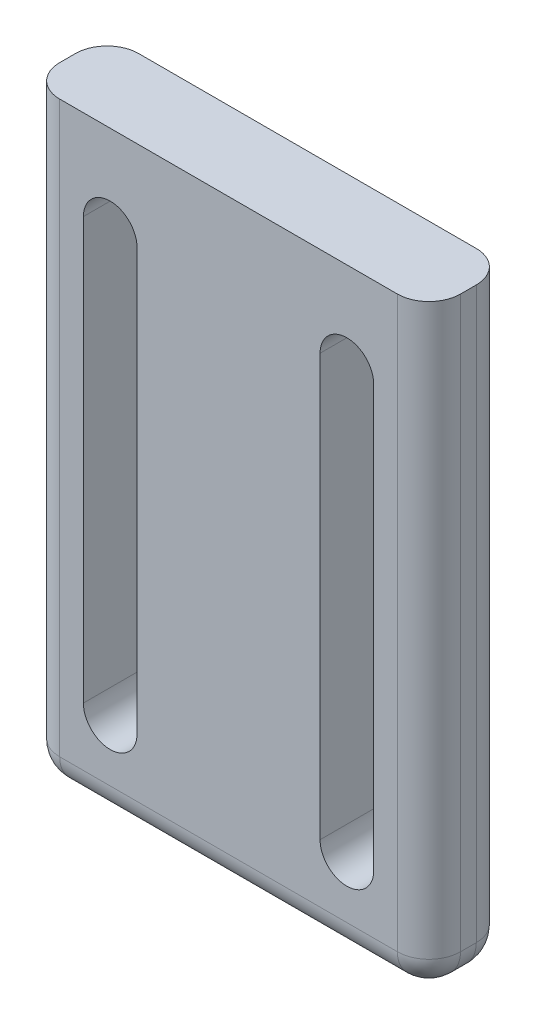
ISO-10303-21;
HEADER;
FILE_DESCRIPTION(('STEP AP214'),'2;1');
FILE_NAME('part.step','',(''),(''),'','','');
FILE_SCHEMA(('AUTOMOTIVE_DESIGN { 1 0 10303 214 1 1 1 1 }'));
ENDSEC;
DATA;
#1=APPLICATION_CONTEXT('core data for automotive mechanical design processes');
#2=APPLICATION_PROTOCOL_DEFINITION('international standard','automotive_design',2000,#1);
#3=PRODUCT_CONTEXT('',#1,'mechanical');
#4=PRODUCT('Part','Part','',(#3));
#5=PRODUCT_RELATED_PRODUCT_CATEGORY('part','',(#4));
#6=PRODUCT_DEFINITION_FORMATION('','',#4);
#7=PRODUCT_DEFINITION_CONTEXT('part definition',#1,'design');
#8=PRODUCT_DEFINITION('design','',#6,#7);
#9=PRODUCT_DEFINITION_SHAPE('','',#8);
#10=(LENGTH_UNIT() NAMED_UNIT(*) SI_UNIT(.MILLI.,.METRE.));
#11=(NAMED_UNIT(*) PLANE_ANGLE_UNIT() SI_UNIT($,.RADIAN.));
#12=(NAMED_UNIT(*) SI_UNIT($,.STERADIAN.) SOLID_ANGLE_UNIT());
#13=UNCERTAINTY_MEASURE_WITH_UNIT(LENGTH_MEASURE(1.E-05),#10,'distance_accuracy_value','');
#14=(GEOMETRIC_REPRESENTATION_CONTEXT(3) GLOBAL_UNCERTAINTY_ASSIGNED_CONTEXT((#13)) GLOBAL_UNIT_ASSIGNED_CONTEXT((#10,
#11,#12)) REPRESENTATION_CONTEXT('',''));
#15=CARTESIAN_POINT('',(0.,0.,0.));
#16=DIRECTION('',(0.,0.,1.));
#17=DIRECTION('',(1.,0.,0.));
#18=AXIS2_PLACEMENT_3D('',#15,#16,#17);
#19=CARTESIAN_POINT('',(7.5,-13.35,5.));
#20=DIRECTION('',(0.,0.,1.));
#21=DIRECTION('',(1.,0.,0.));
#22=AXIS2_PLACEMENT_3D('',#19,#20,#21);
#23=CYLINDRICAL_SURFACE('',#22,1.7);
#24=DIRECTION('',(0.,0.,-1.));
#25=VECTOR('',#24,1.);
#26=CARTESIAN_POINT('',(5.8,-13.35,5.));
#27=LINE('',#26,#25);
#28=CARTESIAN_POINT('',(5.8,-13.35,5.));
#29=VERTEX_POINT('',#28);
#30=CARTESIAN_POINT('',(5.8,-13.35,0.));
#31=VERTEX_POINT('',#30);
#32=EDGE_CURVE('E274',#29,#31,#27,.T.);
#33=ORIENTED_EDGE('',*,*,#32,.F.);
#34=CARTESIAN_POINT('',(7.5,-13.35,5.));
#35=DIRECTION('',(0.,0.,1.));
#36=DIRECTION('',(1.,0.,0.));
#37=AXIS2_PLACEMENT_3D('',#34,#35,#36);
#38=CIRCLE('',#37,1.7);
#39=CARTESIAN_POINT('',(9.2,-13.35,5.));
#40=VERTEX_POINT('',#39);
#41=EDGE_CURVE('E282',#29,#40,#38,.T.);
#42=ORIENTED_EDGE('',*,*,#41,.T.);
#43=DIRECTION('',(0.,0.,-1.));
#44=VECTOR('',#43,1.);
#45=CARTESIAN_POINT('',(9.2,-13.35,5.));
#46=LINE('',#45,#44);
#47=CARTESIAN_POINT('',(9.2,-13.35,0.));
#48=VERTEX_POINT('',#47);
#49=EDGE_CURVE('E278',#48,#40,#46,.F.);
#50=ORIENTED_EDGE('',*,*,#49,.F.);
#51=CARTESIAN_POINT('',(7.5,-13.35,0.));
#52=DIRECTION('',(0.,0.,1.));
#53=DIRECTION('',(1.,0.,0.));
#54=AXIS2_PLACEMENT_3D('',#51,#52,#53);
#55=CIRCLE('',#54,1.7);
#56=EDGE_CURVE('E285',#48,#31,#55,.F.);
#57=ORIENTED_EDGE('',*,*,#56,.T.);
#58=EDGE_LOOP('',(#33,#42,#50,#57));
#59=FACE_BOUND('',#58,.T.);
#60=ADVANCED_FACE('F46',(#59),#23,.F.);
#61=CARTESIAN_POINT('',(7.5,13.35,0.));
#62=DIRECTION('',(0.,0.,1.));
#63=DIRECTION('',(1.,0.,0.));
#64=AXIS2_PLACEMENT_3D('',#61,#62,#63);
#65=CYLINDRICAL_SURFACE('',#64,1.7);
#66=DIRECTION('',(0.,0.,-1.));
#67=VECTOR('',#66,1.);
#68=CARTESIAN_POINT('',(5.8,13.35,0.));
#69=LINE('',#68,#67);
#70=CARTESIAN_POINT('',(5.8,13.35,0.));
#71=VERTEX_POINT('',#70);
#72=CARTESIAN_POINT('',(5.8,13.35,5.));
#73=VERTEX_POINT('',#72);
#74=EDGE_CURVE('E259',#71,#73,#69,.F.);
#75=ORIENTED_EDGE('',*,*,#74,.F.);
#76=CARTESIAN_POINT('',(7.5,13.35,0.));
#77=DIRECTION('',(0.,0.,1.));
#78=DIRECTION('',(1.,0.,0.));
#79=AXIS2_PLACEMENT_3D('',#76,#77,#78);
#80=CIRCLE('',#79,1.7);
#81=CARTESIAN_POINT('',(9.2,13.35,0.));
#82=VERTEX_POINT('',#81);
#83=EDGE_CURVE('E267',#71,#82,#80,.F.);
#84=ORIENTED_EDGE('',*,*,#83,.T.);
#85=DIRECTION('',(0.,0.,-1.));
#86=VECTOR('',#85,1.);
#87=CARTESIAN_POINT('',(9.2,13.35,0.));
#88=LINE('',#87,#86);
#89=CARTESIAN_POINT('',(9.2,13.35,5.));
#90=VERTEX_POINT('',#89);
#91=EDGE_CURVE('E263',#90,#82,#88,.T.);
#92=ORIENTED_EDGE('',*,*,#91,.F.);
#93=CARTESIAN_POINT('',(7.5,13.35,5.));
#94=DIRECTION('',(0.,0.,1.));
#95=DIRECTION('',(1.,0.,0.));
#96=AXIS2_PLACEMENT_3D('',#93,#94,#95);
#97=CIRCLE('',#96,1.7);
#98=EDGE_CURVE('E271',#90,#73,#97,.T.);
#99=ORIENTED_EDGE('',*,*,#98,.T.);
#100=EDGE_LOOP('',(#75,#84,#92,#99));
#101=FACE_BOUND('',#100,.T.);
#102=ADVANCED_FACE('F456',(#101),#65,.F.);
#103=CARTESIAN_POINT('',(-7.5,-13.35,5.));
#104=DIRECTION('',(0.,0.,1.));
#105=DIRECTION('',(1.,0.,0.));
#106=AXIS2_PLACEMENT_3D('',#103,#104,#105);
#107=CYLINDRICAL_SURFACE('',#106,1.7);
#108=DIRECTION('',(0.,0.,-1.));
#109=VECTOR('',#108,1.);
#110=CARTESIAN_POINT('',(-9.2,-13.35,5.));
#111=LINE('',#110,#109);
#112=CARTESIAN_POINT('',(-9.2,-13.35,5.));
#113=VERTEX_POINT('',#112);
#114=CARTESIAN_POINT('',(-9.2,-13.35,0.));
#115=VERTEX_POINT('',#114);
#116=EDGE_CURVE('E188',#113,#115,#111,.T.);
#117=ORIENTED_EDGE('',*,*,#116,.F.);
#118=CARTESIAN_POINT('',(-7.5,-13.35,5.));
#119=DIRECTION('',(0.,0.,1.));
#120=DIRECTION('',(1.,0.,0.));
#121=AXIS2_PLACEMENT_3D('',#118,#119,#120);
#122=CIRCLE('',#121,1.7);
#123=CARTESIAN_POINT('',(-5.8,-13.35,5.));
#124=VERTEX_POINT('',#123);
#125=EDGE_CURVE('E203',#113,#124,#122,.T.);
#126=ORIENTED_EDGE('',*,*,#125,.T.);
#127=DIRECTION('',(0.,0.,-1.));
#128=VECTOR('',#127,1.);
#129=CARTESIAN_POINT('',(-5.8,-13.35,5.));
#130=LINE('',#129,#128);
#131=CARTESIAN_POINT('',(-5.8,-13.35,0.));
#132=VERTEX_POINT('',#131);
#133=EDGE_CURVE('E250',#132,#124,#130,.F.);
#134=ORIENTED_EDGE('',*,*,#133,.F.);
#135=CARTESIAN_POINT('',(-7.5,-13.35,0.));
#136=DIRECTION('',(0.,0.,1.));
#137=DIRECTION('',(1.,0.,0.));
#138=AXIS2_PLACEMENT_3D('',#135,#136,#137);
#139=CIRCLE('',#138,1.7);
#140=EDGE_CURVE('E256',#132,#115,#139,.F.);
#141=ORIENTED_EDGE('',*,*,#140,.T.);
#142=EDGE_LOOP('',(#117,#126,#134,#141));
#143=FACE_BOUND('',#142,.T.);
#144=ADVANCED_FACE('F463',(#143),#107,.F.);
#145=CARTESIAN_POINT('',(-7.5,13.35,0.));
#146=DIRECTION('',(0.,0.,1.));
#147=DIRECTION('',(1.,0.,0.));
#148=AXIS2_PLACEMENT_3D('',#145,#146,#147);
#149=CYLINDRICAL_SURFACE('',#148,1.7);
#150=DIRECTION('',(0.,0.,-1.));
#151=VECTOR('',#150,1.);
#152=CARTESIAN_POINT('',(-9.2,13.35,0.));
#153=LINE('',#152,#151);
#154=CARTESIAN_POINT('',(-9.2,13.35,0.));
#155=VERTEX_POINT('',#154);
#156=CARTESIAN_POINT('',(-9.2,13.35,5.));
#157=VERTEX_POINT('',#156);
#158=EDGE_CURVE('E180',#155,#157,#153,.F.);
#159=ORIENTED_EDGE('',*,*,#158,.F.);
#160=CARTESIAN_POINT('',(-7.5,13.35,0.));
#161=DIRECTION('',(0.,0.,1.));
#162=DIRECTION('',(1.,0.,0.));
#163=AXIS2_PLACEMENT_3D('',#160,#161,#162);
#164=CIRCLE('',#163,1.7);
#165=CARTESIAN_POINT('',(-5.8,13.35,0.));
#166=VERTEX_POINT('',#165);
#167=EDGE_CURVE('E189',#155,#166,#164,.F.);
#168=ORIENTED_EDGE('',*,*,#167,.T.);
#169=DIRECTION('',(0.,0.,-1.));
#170=VECTOR('',#169,1.);
#171=CARTESIAN_POINT('',(-5.8,13.35,0.));
#172=LINE('',#171,#170);
#173=CARTESIAN_POINT('',(-5.8,13.35,5.));
#174=VERTEX_POINT('',#173);
#175=EDGE_CURVE('E183',#174,#166,#172,.T.);
#176=ORIENTED_EDGE('',*,*,#175,.F.);
#177=CARTESIAN_POINT('',(-7.5,13.35,5.));
#178=DIRECTION('',(0.,0.,1.));
#179=DIRECTION('',(1.,0.,0.));
#180=AXIS2_PLACEMENT_3D('',#177,#178,#179);
#181=CIRCLE('',#180,1.7);
#182=EDGE_CURVE('E176',#174,#157,#181,.T.);
#183=ORIENTED_EDGE('',*,*,#182,.T.);
#184=EDGE_LOOP('',(#159,#168,#176,#183));
#185=FACE_BOUND('',#184,.T.);
#186=ADVANCED_FACE('F178',(#185),#149,.F.);
#187=CARTESIAN_POINT('',(12.7,19.05,5.));
#188=DIRECTION('',(-1.,0.,0.));
#189=DIRECTION('',(0.,-1.,0.));
#190=AXIS2_PLACEMENT_3D('',#187,#188,#189);
#191=PLANE('',#190);
#192=DIRECTION('',(0.,0.,-1.));
#193=VECTOR('',#192,1.);
#194=CARTESIAN_POINT('',(12.7,-17.05,5.));
#195=LINE('',#194,#193);
#196=CARTESIAN_POINT('',(12.7,-17.05,3.));
#197=VERTEX_POINT('',#196);
#198=CARTESIAN_POINT('',(12.7,-17.05,2.));
#199=VERTEX_POINT('',#198);
#200=EDGE_CURVE('E288',#197,#199,#195,.T.);
#201=ORIENTED_EDGE('',*,*,#200,.T.);
#202=DIRECTION('',(0.,1.,0.));
#203=VECTOR('',#202,1.);
#204=CARTESIAN_POINT('',(12.7,19.05,2.));
#205=LINE('',#204,#203);
#206=CARTESIAN_POINT('',(12.7,19.05,2.));
#207=VERTEX_POINT('',#206);
#208=EDGE_CURVE('E294',#199,#207,#205,.T.);
#209=ORIENTED_EDGE('',*,*,#208,.T.);
#210=DIRECTION('',(0.,0.,-1.));
#211=VECTOR('',#210,1.);
#212=CARTESIAN_POINT('',(12.7,19.05,5.));
#213=LINE('',#212,#211);
#214=CARTESIAN_POINT('',(12.7,19.05,3.));
#215=VERTEX_POINT('',#214);
#216=EDGE_CURVE('E199',#215,#207,#213,.T.);
#217=ORIENTED_EDGE('',*,*,#216,.F.);
#218=DIRECTION('',(0.,1.,0.));
#219=VECTOR('',#218,1.);
#220=CARTESIAN_POINT('',(12.7,-19.05,3.));
#221=LINE('',#220,#219);
#222=EDGE_CURVE('E291',#215,#197,#221,.F.);
#223=ORIENTED_EDGE('',*,*,#222,.T.);
#224=EDGE_LOOP('',(#201,#209,#217,#223));
#225=FACE_BOUND('',#224,.T.);
#226=ADVANCED_FACE('F435',(#225),#191,.F.);
#227=CARTESIAN_POINT('',(-12.7,19.05,5.));
#228=DIRECTION('',(0.,-1.,0.));
#229=DIRECTION('',(0.,0.,-1.));
#230=AXIS2_PLACEMENT_3D('',#227,#228,#229);
#231=PLANE('',#230);
#232=ORIENTED_EDGE('',*,*,#216,.T.);
#233=CARTESIAN_POINT('',(10.7,19.05,2.));
#234=DIRECTION('',(0.,-1.,0.));
#235=DIRECTION('',(0.,0.,-1.));
#236=AXIS2_PLACEMENT_3D('',#233,#234,#235);
#237=CIRCLE('',#236,2.);
#238=CARTESIAN_POINT('',(10.7,19.05,0.));
#239=VERTEX_POINT('',#238);
#240=EDGE_CURVE('E307',#207,#239,#237,.F.);
#241=ORIENTED_EDGE('',*,*,#240,.T.);
#242=DIRECTION('',(-1.,0.,0.));
#243=VECTOR('',#242,1.);
#244=CARTESIAN_POINT('',(-12.7,19.05,0.));
#245=LINE('',#244,#243);
#246=CARTESIAN_POINT('',(-10.7,19.05,0.));
#247=VERTEX_POINT('',#246);
#248=EDGE_CURVE('E234',#239,#247,#245,.T.);
#249=ORIENTED_EDGE('',*,*,#248,.T.);
#250=CARTESIAN_POINT('',(-10.7,19.05,2.));
#251=DIRECTION('',(0.,-1.,0.));
#252=DIRECTION('',(0.,0.,-1.));
#253=AXIS2_PLACEMENT_3D('',#250,#251,#252);
#254=CIRCLE('',#253,2.);
#255=CARTESIAN_POINT('',(-12.7,19.05,2.));
#256=VERTEX_POINT('',#255);
#257=EDGE_CURVE('E301',#247,#256,#254,.F.);
#258=ORIENTED_EDGE('',*,*,#257,.T.);
#259=DIRECTION('',(0.,0.,-1.));
#260=VECTOR('',#259,1.);
#261=CARTESIAN_POINT('',(-12.7,19.05,5.));
#262=LINE('',#261,#260);
#263=CARTESIAN_POINT('',(-12.7,19.05,3.));
#264=VERTEX_POINT('',#263);
#265=EDGE_CURVE('E233',#264,#256,#262,.T.);
#266=ORIENTED_EDGE('',*,*,#265,.F.);
#267=CARTESIAN_POINT('',(-10.7,19.05,3.));
#268=DIRECTION('',(0.,-1.,0.));
#269=DIRECTION('',(0.,0.,-1.));
#270=AXIS2_PLACEMENT_3D('',#267,#268,#269);
#271=CIRCLE('',#270,2.);
#272=CARTESIAN_POINT('',(-10.7,19.05,5.));
#273=VERTEX_POINT('',#272);
#274=EDGE_CURVE('E298',#264,#273,#271,.F.);
#275=ORIENTED_EDGE('',*,*,#274,.T.);
#276=DIRECTION('',(-1.,0.,0.));
#277=VECTOR('',#276,1.);
#278=CARTESIAN_POINT('',(-12.7,19.05,5.));
#279=LINE('',#278,#277);
#280=CARTESIAN_POINT('',(10.7,19.05,5.));
#281=VERTEX_POINT('',#280);
#282=EDGE_CURVE('E229',#281,#273,#279,.T.);
#283=ORIENTED_EDGE('',*,*,#282,.F.);
#284=CARTESIAN_POINT('',(10.7,19.05,3.));
#285=DIRECTION('',(0.,-1.,0.));
#286=DIRECTION('',(0.,0.,-1.));
#287=AXIS2_PLACEMENT_3D('',#284,#285,#286);
#288=CIRCLE('',#287,2.);
#289=EDGE_CURVE('E304',#281,#215,#288,.F.);
#290=ORIENTED_EDGE('',*,*,#289,.T.);
#291=EDGE_LOOP('',(#232,#241,#249,#258,#266,#275,#283,#290));
#292=FACE_BOUND('',#291,.T.);
#293=ADVANCED_FACE('F404',(#292),#231,.F.);
#294=CARTESIAN_POINT('',(-12.7,19.05,5.));
#295=DIRECTION('',(1.,0.,0.));
#296=DIRECTION('',(0.,1.,0.));
#297=AXIS2_PLACEMENT_3D('',#294,#295,#296);
#298=PLANE('',#297);
#299=ORIENTED_EDGE('',*,*,#265,.T.);
#300=DIRECTION('',(0.,-1.,0.));
#301=VECTOR('',#300,1.);
#302=CARTESIAN_POINT('',(-12.7,19.05,2.));
#303=LINE('',#302,#301);
#304=CARTESIAN_POINT('',(-12.7,-17.05,2.));
#305=VERTEX_POINT('',#304);
#306=EDGE_CURVE('E334',#256,#305,#303,.T.);
#307=ORIENTED_EDGE('',*,*,#306,.T.);
#308=DIRECTION('',(0.,0.,-1.));
#309=VECTOR('',#308,1.);
#310=CARTESIAN_POINT('',(-12.7,-17.05,5.));
#311=LINE('',#310,#309);
#312=CARTESIAN_POINT('',(-12.7,-17.05,3.));
#313=VERTEX_POINT('',#312);
#314=EDGE_CURVE('E328',#305,#313,#311,.F.);
#315=ORIENTED_EDGE('',*,*,#314,.T.);
#316=DIRECTION('',(0.,-1.,0.));
#317=VECTOR('',#316,1.);
#318=CARTESIAN_POINT('',(-12.7,19.05,3.));
#319=LINE('',#318,#317);
#320=EDGE_CURVE('E331',#313,#264,#319,.F.);
#321=ORIENTED_EDGE('',*,*,#320,.T.);
#322=EDGE_LOOP('',(#299,#307,#315,#321));
#323=FACE_BOUND('',#322,.T.);
#324=ADVANCED_FACE('F401',(#323),#298,.F.);
#325=CARTESIAN_POINT('',(-12.7,-19.05,5.));
#326=DIRECTION('',(0.,1.,0.));
#327=DIRECTION('',(0.,0.,1.));
#328=AXIS2_PLACEMENT_3D('',#325,#326,#327);
#329=PLANE('',#328);
#330=DIRECTION('',(1.,0.,0.));
#331=VECTOR('',#330,1.);
#332=CARTESIAN_POINT('',(-12.7,-19.05,2.));
#333=LINE('',#332,#331);
#334=CARTESIAN_POINT('',(-10.7,-19.05,2.));
#335=VERTEX_POINT('',#334);
#336=CARTESIAN_POINT('',(10.7,-19.05,2.));
#337=VERTEX_POINT('',#336);
#338=EDGE_CURVE('E56',#335,#337,#333,.T.);
#339=ORIENTED_EDGE('',*,*,#338,.T.);
#340=DIRECTION('',(0.,0.,-1.));
#341=VECTOR('',#340,1.);
#342=CARTESIAN_POINT('',(10.7,-19.05,5.));
#343=LINE('',#342,#341);
#344=CARTESIAN_POINT('',(10.7,-19.05,3.));
#345=VERTEX_POINT('',#344);
#346=EDGE_CURVE('E11',#337,#345,#343,.F.);
#347=ORIENTED_EDGE('',*,*,#346,.T.);
#348=DIRECTION('',(1.,0.,0.));
#349=VECTOR('',#348,1.);
#350=CARTESIAN_POINT('',(-12.7,-19.05,3.));
#351=LINE('',#350,#349);
#352=CARTESIAN_POINT('',(-10.7,-19.05,3.));
#353=VERTEX_POINT('',#352);
#354=EDGE_CURVE('E340',#345,#353,#351,.F.);
#355=ORIENTED_EDGE('',*,*,#354,.T.);
#356=DIRECTION('',(0.,0.,-1.));
#357=VECTOR('',#356,1.);
#358=CARTESIAN_POINT('',(-10.7,-19.05,5.));
#359=LINE('',#358,#357);
#360=EDGE_CURVE('E337',#353,#335,#359,.T.);
#361=ORIENTED_EDGE('',*,*,#360,.T.);
#362=EDGE_LOOP('',(#339,#347,#355,#361));
#363=FACE_BOUND('',#362,.T.);
#364=ADVANCED_FACE('F421',(#363),#329,.F.);
#365=CARTESIAN_POINT('',(0.,0.,5.));
#366=DIRECTION('',(0.,0.,1.));
#367=DIRECTION('',(1.,0.,0.));
#368=AXIS2_PLACEMENT_3D('',#365,#366,#367);
#369=PLANE('',#368);
#370=DIRECTION('',(0.,1.,0.));
#371=VECTOR('',#370,1.);
#372=CARTESIAN_POINT('',(-5.8,-15.05,5.));
#373=LINE('',#372,#371);
#374=EDGE_CURVE('E207',#124,#174,#373,.T.);
#375=ORIENTED_EDGE('',*,*,#374,.F.);
#376=ORIENTED_EDGE('',*,*,#125,.F.);
#377=DIRECTION('',(0.,-1.,0.));
#378=VECTOR('',#377,1.);
#379=CARTESIAN_POINT('',(-9.2,-15.05,5.));
#380=LINE('',#379,#378);
#381=EDGE_CURVE('E195',#157,#113,#380,.T.);
#382=ORIENTED_EDGE('',*,*,#381,.F.);
#383=ORIENTED_EDGE('',*,*,#182,.F.);
#384=EDGE_LOOP('',(#375,#376,#382,#383));
#385=FACE_BOUND('',#384,.T.);
#386=DIRECTION('',(0.,1.,0.));
#387=VECTOR('',#386,1.);
#388=CARTESIAN_POINT('',(9.2,-15.05,5.));
#389=LINE('',#388,#387);
#390=EDGE_CURVE('E212',#40,#90,#389,.T.);
#391=ORIENTED_EDGE('',*,*,#390,.F.);
#392=ORIENTED_EDGE('',*,*,#41,.F.);
#393=DIRECTION('',(0.,-1.,0.));
#394=VECTOR('',#393,1.);
#395=CARTESIAN_POINT('',(5.8,-15.05,5.));
#396=LINE('',#395,#394);
#397=EDGE_CURVE('E216',#73,#29,#396,.T.);
#398=ORIENTED_EDGE('',*,*,#397,.F.);
#399=ORIENTED_EDGE('',*,*,#98,.F.);
#400=EDGE_LOOP('',(#391,#392,#398,#399));
#401=FACE_BOUND('',#400,.T.);
#402=DIRECTION('',(1.,0.,0.));
#403=VECTOR('',#402,1.);
#404=CARTESIAN_POINT('',(12.7,-17.05,5.));
#405=LINE('',#404,#403);
#406=CARTESIAN_POINT('',(-10.7,-17.05,5.));
#407=VERTEX_POINT('',#406);
#408=CARTESIAN_POINT('',(10.7,-17.05,5.));
#409=VERTEX_POINT('',#408);
#410=EDGE_CURVE('E319',#407,#409,#405,.T.);
#411=ORIENTED_EDGE('',*,*,#410,.T.);
#412=DIRECTION('',(0.,1.,0.));
#413=VECTOR('',#412,1.);
#414=CARTESIAN_POINT('',(10.7,19.05,5.));
#415=LINE('',#414,#413);
#416=EDGE_CURVE('E325',#409,#281,#415,.T.);
#417=ORIENTED_EDGE('',*,*,#416,.T.);
#418=ORIENTED_EDGE('',*,*,#282,.T.);
#419=DIRECTION('',(0.,-1.,0.));
#420=VECTOR('',#419,1.);
#421=CARTESIAN_POINT('',(-10.7,-19.05,5.));
#422=LINE('',#421,#420);
#423=EDGE_CURVE('E322',#273,#407,#422,.T.);
#424=ORIENTED_EDGE('',*,*,#423,.T.);
#425=EDGE_LOOP('',(#411,#417,#418,#424));
#426=FACE_BOUND('',#425,.T.);
#427=ADVANCED_FACE('F201',(#385,#401,#426),#369,.T.);
#428=CARTESIAN_POINT('',(0.,0.,0.));
#429=DIRECTION('',(0.,0.,1.));
#430=DIRECTION('',(1.,0.,0.));
#431=AXIS2_PLACEMENT_3D('',#428,#429,#430);
#432=PLANE('',#431);
#433=ORIENTED_EDGE('',*,*,#248,.F.);
#434=DIRECTION('',(0.,1.,0.));
#435=VECTOR('',#434,1.);
#436=CARTESIAN_POINT('',(10.7,0.,0.));
#437=LINE('',#436,#435);
#438=CARTESIAN_POINT('',(10.7,-17.05,0.));
#439=VERTEX_POINT('',#438);
#440=EDGE_CURVE('E316',#239,#439,#437,.F.);
#441=ORIENTED_EDGE('',*,*,#440,.T.);
#442=DIRECTION('',(1.,0.,0.));
#443=VECTOR('',#442,1.);
#444=CARTESIAN_POINT('',(0.,-17.05,0.));
#445=LINE('',#444,#443);
#446=CARTESIAN_POINT('',(-10.7,-17.05,0.));
#447=VERTEX_POINT('',#446);
#448=EDGE_CURVE('E310',#439,#447,#445,.F.);
#449=ORIENTED_EDGE('',*,*,#448,.T.);
#450=DIRECTION('',(0.,-1.,0.));
#451=VECTOR('',#450,1.);
#452=CARTESIAN_POINT('',(-10.7,0.,0.));
#453=LINE('',#452,#451);
#454=EDGE_CURVE('E313',#447,#247,#453,.F.);
#455=ORIENTED_EDGE('',*,*,#454,.T.);
#456=EDGE_LOOP('',(#433,#441,#449,#455));
#457=FACE_BOUND('',#456,.T.);
#458=ORIENTED_EDGE('',*,*,#56,.F.);
#459=DIRECTION('',(0.,1.,0.));
#460=VECTOR('',#459,1.);
#461=CARTESIAN_POINT('',(9.2,-15.05,0.));
#462=LINE('',#461,#460);
#463=EDGE_CURVE('E220',#48,#82,#462,.T.);
#464=ORIENTED_EDGE('',*,*,#463,.T.);
#465=ORIENTED_EDGE('',*,*,#83,.F.);
#466=DIRECTION('',(0.,-1.,0.));
#467=VECTOR('',#466,1.);
#468=CARTESIAN_POINT('',(5.8,-15.05,0.));
#469=LINE('',#468,#467);
#470=EDGE_CURVE('E223',#71,#31,#469,.T.);
#471=ORIENTED_EDGE('',*,*,#470,.T.);
#472=EDGE_LOOP('',(#458,#464,#465,#471));
#473=FACE_BOUND('',#472,.T.);
#474=ORIENTED_EDGE('',*,*,#140,.F.);
#475=DIRECTION('',(0.,1.,0.));
#476=VECTOR('',#475,1.);
#477=CARTESIAN_POINT('',(-5.8,-15.05,0.));
#478=LINE('',#477,#476);
#479=EDGE_CURVE('E206',#132,#166,#478,.T.);
#480=ORIENTED_EDGE('',*,*,#479,.T.);
#481=ORIENTED_EDGE('',*,*,#167,.F.);
#482=DIRECTION('',(0.,-1.,0.));
#483=VECTOR('',#482,1.);
#484=CARTESIAN_POINT('',(-9.2,-15.05,0.));
#485=LINE('',#484,#483);
#486=EDGE_CURVE('E197',#155,#115,#485,.T.);
#487=ORIENTED_EDGE('',*,*,#486,.T.);
#488=EDGE_LOOP('',(#474,#480,#481,#487));
#489=FACE_BOUND('',#488,.T.);
#490=ADVANCED_FACE('F442',(#457,#473,#489),#432,.F.);
#491=CARTESIAN_POINT('',(9.2,-15.05,0.));
#492=DIRECTION('',(1.,0.,0.));
#493=DIRECTION('',(0.,0.,-1.));
#494=AXIS2_PLACEMENT_3D('',#491,#492,#493);
#495=PLANE('',#494);
#496=ORIENTED_EDGE('',*,*,#463,.F.);
#497=ORIENTED_EDGE('',*,*,#49,.T.);
#498=ORIENTED_EDGE('',*,*,#390,.T.);
#499=ORIENTED_EDGE('',*,*,#91,.T.);
#500=EDGE_LOOP('',(#496,#497,#498,#499));
#501=FACE_BOUND('',#500,.T.);
#502=ADVANCED_FACE('F495',(#501),#495,.F.);
#503=CARTESIAN_POINT('',(5.8,-15.05,0.));
#504=DIRECTION('',(-1.,0.,0.));
#505=DIRECTION('',(0.,0.,1.));
#506=AXIS2_PLACEMENT_3D('',#503,#504,#505);
#507=PLANE('',#506);
#508=ORIENTED_EDGE('',*,*,#397,.T.);
#509=ORIENTED_EDGE('',*,*,#32,.T.);
#510=ORIENTED_EDGE('',*,*,#470,.F.);
#511=ORIENTED_EDGE('',*,*,#74,.T.);
#512=EDGE_LOOP('',(#508,#509,#510,#511));
#513=FACE_BOUND('',#512,.T.);
#514=ADVANCED_FACE('F498',(#513),#507,.F.);
#515=CARTESIAN_POINT('',(-5.8,-15.05,0.));
#516=DIRECTION('',(1.,0.,0.));
#517=DIRECTION('',(0.,0.,-1.));
#518=AXIS2_PLACEMENT_3D('',#515,#516,#517);
#519=PLANE('',#518);
#520=ORIENTED_EDGE('',*,*,#479,.F.);
#521=ORIENTED_EDGE('',*,*,#133,.T.);
#522=ORIENTED_EDGE('',*,*,#374,.T.);
#523=ORIENTED_EDGE('',*,*,#175,.T.);
#524=EDGE_LOOP('',(#520,#521,#522,#523));
#525=FACE_BOUND('',#524,.T.);
#526=ADVANCED_FACE('F501',(#525),#519,.F.);
#527=CARTESIAN_POINT('',(-9.2,-15.05,0.));
#528=DIRECTION('',(-1.,0.,0.));
#529=DIRECTION('',(0.,0.,1.));
#530=AXIS2_PLACEMENT_3D('',#527,#528,#529);
#531=PLANE('',#530);
#532=ORIENTED_EDGE('',*,*,#381,.T.);
#533=ORIENTED_EDGE('',*,*,#116,.T.);
#534=ORIENTED_EDGE('',*,*,#486,.F.);
#535=ORIENTED_EDGE('',*,*,#158,.T.);
#536=EDGE_LOOP('',(#532,#533,#534,#535));
#537=FACE_BOUND('',#536,.T.);
#538=ADVANCED_FACE('F193',(#537),#531,.F.);
#539=CARTESIAN_POINT('',(-10.7,0.,3.));
#540=DIRECTION('',(0.,1.,0.));
#541=DIRECTION('',(-1.,0.,0.));
#542=AXIS2_PLACEMENT_3D('',#539,#540,#541);
#543=CYLINDRICAL_SURFACE('',#542,2.);
#544=CARTESIAN_POINT('',(-10.7,-17.05,3.));
#545=DIRECTION('',(0.,-1.,0.));
#546=DIRECTION('',(0.,0.,-1.));
#547=AXIS2_PLACEMENT_3D('',#544,#545,#546);
#548=CIRCLE('',#547,2.);
#549=EDGE_CURVE('E50',#407,#313,#548,.T.);
#550=ORIENTED_EDGE('',*,*,#549,.F.);
#551=ORIENTED_EDGE('',*,*,#423,.F.);
#552=ORIENTED_EDGE('',*,*,#274,.F.);
#553=ORIENTED_EDGE('',*,*,#320,.F.);
#554=EDGE_LOOP('',(#550,#551,#552,#553));
#555=FACE_BOUND('',#554,.T.);
#556=ADVANCED_FACE('F48',(#555),#543,.T.);
#557=CARTESIAN_POINT('',(-10.7,-17.05,3.));
#558=DIRECTION('',(-1.,0.,0.));
#559=DIRECTION('',(0.,0.,1.));
#560=AXIS2_PLACEMENT_3D('',#557,#558,#559);
#561=SPHERICAL_SURFACE('',#560,2.);
#562=CARTESIAN_POINT('',(-10.7,-17.05,3.));
#563=DIRECTION('',(-1.,0.,0.));
#564=DIRECTION('',(0.,0.,1.));
#565=AXIS2_PLACEMENT_3D('',#562,#563,#564);
#566=CIRCLE('',#565,2.);
#567=EDGE_CURVE('E378',#407,#353,#566,.F.);
#568=ORIENTED_EDGE('',*,*,#567,.F.);
#569=ORIENTED_EDGE('',*,*,#549,.T.);
#570=CARTESIAN_POINT('',(-10.7,-17.05,3.));
#571=DIRECTION('',(0.,0.,1.));
#572=DIRECTION('',(1.,0.,0.));
#573=AXIS2_PLACEMENT_3D('',#570,#571,#572);
#574=CIRCLE('',#573,2.);
#575=EDGE_CURVE('E381',#353,#313,#574,.F.);
#576=ORIENTED_EDGE('',*,*,#575,.F.);
#577=EDGE_LOOP('',(#568,#569,#576));
#578=FACE_BOUND('',#577,.T.);
#579=ADVANCED_FACE('F393',(#578),#561,.T.);
#580=CARTESIAN_POINT('',(-10.7,19.05,2.));
#581=DIRECTION('',(0.,-1.,0.));
#582=DIRECTION('',(1.,0.,0.));
#583=AXIS2_PLACEMENT_3D('',#580,#581,#582);
#584=CYLINDRICAL_SURFACE('',#583,2.);
#585=ORIENTED_EDGE('',*,*,#257,.F.);
#586=ORIENTED_EDGE('',*,*,#454,.F.);
#587=CARTESIAN_POINT('',(-10.7,-17.05,2.));
#588=DIRECTION('',(0.,-1.,0.));
#589=DIRECTION('',(0.,0.,-1.));
#590=AXIS2_PLACEMENT_3D('',#587,#588,#589);
#591=CIRCLE('',#590,2.);
#592=EDGE_CURVE('E374',#305,#447,#591,.T.);
#593=ORIENTED_EDGE('',*,*,#592,.F.);
#594=ORIENTED_EDGE('',*,*,#306,.F.);
#595=EDGE_LOOP('',(#585,#586,#593,#594));
#596=FACE_BOUND('',#595,.T.);
#597=ADVANCED_FACE('F410',(#596),#584,.T.);
#598=CARTESIAN_POINT('',(-10.7,-17.05,5.));
#599=DIRECTION('',(0.,0.,-1.));
#600=DIRECTION('',(-1.,0.,0.));
#601=AXIS2_PLACEMENT_3D('',#598,#599,#600);
#602=CYLINDRICAL_SURFACE('',#601,2.);
#603=ORIENTED_EDGE('',*,*,#575,.T.);
#604=ORIENTED_EDGE('',*,*,#314,.F.);
#605=CARTESIAN_POINT('',(-10.7,-17.05,2.));
#606=DIRECTION('',(0.,0.,-1.));
#607=DIRECTION('',(-1.,0.,0.));
#608=AXIS2_PLACEMENT_3D('',#605,#606,#607);
#609=CIRCLE('',#608,2.);
#610=EDGE_CURVE('E370',#335,#305,#609,.T.);
#611=ORIENTED_EDGE('',*,*,#610,.F.);
#612=ORIENTED_EDGE('',*,*,#360,.F.);
#613=EDGE_LOOP('',(#603,#604,#611,#612));
#614=FACE_BOUND('',#613,.T.);
#615=ADVANCED_FACE('F413',(#614),#602,.T.);
#616=CARTESIAN_POINT('',(0.,-17.05,3.));
#617=DIRECTION('',(-1.,0.,0.));
#618=DIRECTION('',(0.,0.,1.));
#619=AXIS2_PLACEMENT_3D('',#616,#617,#618);
#620=CYLINDRICAL_SURFACE('',#619,2.);
#621=ORIENTED_EDGE('',*,*,#567,.T.);
#622=ORIENTED_EDGE('',*,*,#354,.F.);
#623=CARTESIAN_POINT('',(10.7,-17.05,3.));
#624=DIRECTION('',(1.,0.,0.));
#625=DIRECTION('',(0.,0.,-1.));
#626=AXIS2_PLACEMENT_3D('',#623,#624,#625);
#627=CIRCLE('',#626,2.);
#628=EDGE_CURVE('E366',#409,#345,#627,.T.);
#629=ORIENTED_EDGE('',*,*,#628,.F.);
#630=ORIENTED_EDGE('',*,*,#410,.F.);
#631=EDGE_LOOP('',(#621,#622,#629,#630));
#632=FACE_BOUND('',#631,.T.);
#633=ADVANCED_FACE('F424',(#632),#620,.T.);
#634=CARTESIAN_POINT('',(10.7,0.,3.));
#635=DIRECTION('',(0.,-1.,0.));
#636=DIRECTION('',(1.,0.,0.));
#637=AXIS2_PLACEMENT_3D('',#634,#635,#636);
#638=CYLINDRICAL_SURFACE('',#637,2.);
#639=ORIENTED_EDGE('',*,*,#289,.F.);
#640=ORIENTED_EDGE('',*,*,#416,.F.);
#641=CARTESIAN_POINT('',(10.7,-17.05,3.));
#642=DIRECTION('',(0.,-1.,0.));
#643=DIRECTION('',(0.,0.,-1.));
#644=AXIS2_PLACEMENT_3D('',#641,#642,#643);
#645=CIRCLE('',#644,2.);
#646=EDGE_CURVE('E362',#197,#409,#645,.T.);
#647=ORIENTED_EDGE('',*,*,#646,.F.);
#648=ORIENTED_EDGE('',*,*,#222,.F.);
#649=EDGE_LOOP('',(#639,#640,#647,#648));
#650=FACE_BOUND('',#649,.T.);
#651=ADVANCED_FACE('F430',(#650),#638,.T.);
#652=CARTESIAN_POINT('',(-10.7,-17.05,2.));
#653=DIRECTION('',(-1.,0.,0.));
#654=DIRECTION('',(0.,0.,1.));
#655=AXIS2_PLACEMENT_3D('',#652,#653,#654);
#656=SPHERICAL_SURFACE('',#655,2.);
#657=ORIENTED_EDGE('',*,*,#610,.T.);
#658=ORIENTED_EDGE('',*,*,#592,.T.);
#659=CARTESIAN_POINT('',(-10.7,-17.05,2.));
#660=DIRECTION('',(-1.,0.,0.));
#661=DIRECTION('',(0.,0.,1.));
#662=AXIS2_PLACEMENT_3D('',#659,#660,#661);
#663=CIRCLE('',#662,2.);
#664=EDGE_CURVE('E358',#335,#447,#663,.F.);
#665=ORIENTED_EDGE('',*,*,#664,.F.);
#666=EDGE_LOOP('',(#657,#658,#665));
#667=FACE_BOUND('',#666,.T.);
#668=ADVANCED_FACE('F417',(#667),#656,.T.);
#669=CARTESIAN_POINT('',(10.7,-17.05,3.));
#670=DIRECTION('',(0.,0.,1.));
#671=DIRECTION('',(1.,0.,0.));
#672=AXIS2_PLACEMENT_3D('',#669,#670,#671);
#673=SPHERICAL_SURFACE('',#672,2.);
#674=ORIENTED_EDGE('',*,*,#646,.T.);
#675=ORIENTED_EDGE('',*,*,#628,.T.);
#676=CARTESIAN_POINT('',(10.7,-17.05,3.));
#677=DIRECTION('',(0.,0.,1.));
#678=DIRECTION('',(1.,0.,0.));
#679=AXIS2_PLACEMENT_3D('',#676,#677,#678);
#680=CIRCLE('',#679,2.);
#681=EDGE_CURVE('E354',#197,#345,#680,.F.);
#682=ORIENTED_EDGE('',*,*,#681,.F.);
#683=EDGE_LOOP('',(#674,#675,#682));
#684=FACE_BOUND('',#683,.T.);
#685=ADVANCED_FACE('F528',(#684),#673,.T.);
#686=CARTESIAN_POINT('',(-12.7,-17.05,2.));
#687=DIRECTION('',(1.,0.,0.));
#688=DIRECTION('',(0.,0.,-1.));
#689=AXIS2_PLACEMENT_3D('',#686,#687,#688);
#690=CYLINDRICAL_SURFACE('',#689,2.);
#691=ORIENTED_EDGE('',*,*,#664,.T.);
#692=ORIENTED_EDGE('',*,*,#448,.F.);
#693=CARTESIAN_POINT('',(10.7,-17.05,2.));
#694=DIRECTION('',(1.,0.,0.));
#695=DIRECTION('',(0.,0.,-1.));
#696=AXIS2_PLACEMENT_3D('',#693,#694,#695);
#697=CIRCLE('',#696,2.);
#698=EDGE_CURVE('E351',#337,#439,#697,.T.);
#699=ORIENTED_EDGE('',*,*,#698,.F.);
#700=ORIENTED_EDGE('',*,*,#338,.F.);
#701=EDGE_LOOP('',(#691,#692,#699,#700));
#702=FACE_BOUND('',#701,.T.);
#703=ADVANCED_FACE('F420',(#702),#690,.T.);
#704=CARTESIAN_POINT('',(10.7,-17.05,5.));
#705=DIRECTION('',(0.,0.,-1.));
#706=DIRECTION('',(-1.,0.,0.));
#707=AXIS2_PLACEMENT_3D('',#704,#705,#706);
#708=CYLINDRICAL_SURFACE('',#707,2.);
#709=ORIENTED_EDGE('',*,*,#681,.T.);
#710=ORIENTED_EDGE('',*,*,#346,.F.);
#711=CARTESIAN_POINT('',(10.7,-17.05,2.));
#712=DIRECTION('',(0.,0.,-1.));
#713=DIRECTION('',(-1.,0.,0.));
#714=AXIS2_PLACEMENT_3D('',#711,#712,#713);
#715=CIRCLE('',#714,2.);
#716=EDGE_CURVE('E64',#199,#337,#715,.T.);
#717=ORIENTED_EDGE('',*,*,#716,.F.);
#718=ORIENTED_EDGE('',*,*,#200,.F.);
#719=EDGE_LOOP('',(#709,#710,#717,#718));
#720=FACE_BOUND('',#719,.T.);
#721=ADVANCED_FACE('F446',(#720),#708,.T.);
#722=CARTESIAN_POINT('',(10.7,-17.05,2.));
#723=DIRECTION('',(0.,-1.,0.));
#724=DIRECTION('',(0.,0.,-1.));
#725=AXIS2_PLACEMENT_3D('',#722,#723,#724);
#726=SPHERICAL_SURFACE('',#725,2.);
#727=ORIENTED_EDGE('',*,*,#716,.T.);
#728=ORIENTED_EDGE('',*,*,#698,.T.);
#729=CARTESIAN_POINT('',(10.7,-17.05,2.));
#730=DIRECTION('',(0.,-1.,0.));
#731=DIRECTION('',(1.,0.,0.));
#732=AXIS2_PLACEMENT_3D('',#729,#730,#731);
#733=CIRCLE('',#732,2.);
#734=EDGE_CURVE('E345',#199,#439,#733,.F.);
#735=ORIENTED_EDGE('',*,*,#734,.F.);
#736=EDGE_LOOP('',(#727,#728,#735));
#737=FACE_BOUND('',#736,.T.);
#738=ADVANCED_FACE('F444',(#737),#726,.T.);
#739=CARTESIAN_POINT('',(10.7,19.05,2.));
#740=DIRECTION('',(0.,1.,0.));
#741=DIRECTION('',(-1.,0.,0.));
#742=AXIS2_PLACEMENT_3D('',#739,#740,#741);
#743=CYLINDRICAL_SURFACE('',#742,2.);
#744=ORIENTED_EDGE('',*,*,#734,.T.);
#745=ORIENTED_EDGE('',*,*,#440,.F.);
#746=ORIENTED_EDGE('',*,*,#240,.F.);
#747=ORIENTED_EDGE('',*,*,#208,.F.);
#748=EDGE_LOOP('',(#744,#745,#746,#747));
#749=FACE_BOUND('',#748,.T.);
#750=ADVANCED_FACE('F439',(#749),#743,.T.);
#751=CLOSED_SHELL('',(#60,#102,#144,#186,#226,#293,#324,#364,#427,#490,#502,#514,#526,#538,#556,
#579,#597,#615,#633,#651,#668,#685,#703,#721,#738,#750));
#752=MANIFOLD_SOLID_BREP('B2',#751);
#753=ADVANCED_BREP_SHAPE_REPRESENTATION('',(#18,#752),#14);
#754=SHAPE_DEFINITION_REPRESENTATION(#9,#753);
ENDSEC;
END-ISO-10303-21;
